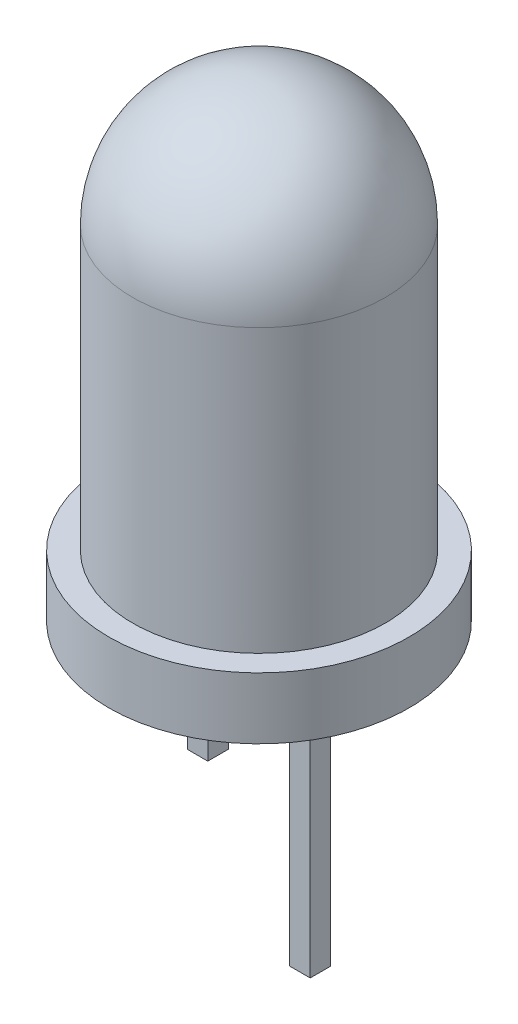
ISO-10303-21;
HEADER;
FILE_DESCRIPTION(('STEP AP214'),'2;1');
FILE_NAME('part.step','',(''),(''),'','','');
FILE_SCHEMA(('AUTOMOTIVE_DESIGN { 1 0 10303 214 1 1 1 1 }'));
ENDSEC;
DATA;
#1=APPLICATION_CONTEXT('core data for automotive mechanical design processes');
#2=APPLICATION_PROTOCOL_DEFINITION('international standard','automotive_design',2000,#1);
#3=PRODUCT_CONTEXT('',#1,'mechanical');
#4=PRODUCT('Part','Part','',(#3));
#5=PRODUCT_RELATED_PRODUCT_CATEGORY('part','',(#4));
#6=PRODUCT_DEFINITION_FORMATION('','',#4);
#7=PRODUCT_DEFINITION_CONTEXT('part definition',#1,'design');
#8=PRODUCT_DEFINITION('design','',#6,#7);
#9=PRODUCT_DEFINITION_SHAPE('','',#8);
#10=(LENGTH_UNIT() NAMED_UNIT(*) SI_UNIT(.MILLI.,.METRE.));
#11=(NAMED_UNIT(*) PLANE_ANGLE_UNIT() SI_UNIT($,.RADIAN.));
#12=(NAMED_UNIT(*) SI_UNIT($,.STERADIAN.) SOLID_ANGLE_UNIT());
#13=UNCERTAINTY_MEASURE_WITH_UNIT(LENGTH_MEASURE(1.E-05),#10,'distance_accuracy_value','');
#14=(GEOMETRIC_REPRESENTATION_CONTEXT(3) GLOBAL_UNCERTAINTY_ASSIGNED_CONTEXT((#13)) GLOBAL_UNIT_ASSIGNED_CONTEXT((#10,
#11,#12)) REPRESENTATION_CONTEXT('',''));
#15=CARTESIAN_POINT('',(0.,0.,0.));
#16=DIRECTION('',(0.,0.,1.));
#17=DIRECTION('',(1.,0.,0.));
#18=AXIS2_PLACEMENT_3D('',#15,#16,#17);
#19=CARTESIAN_POINT('',(-0.00715449381111586,-11.2789100086179,0.));
#20=DIRECTION('',(0.,-1.,0.));
#21=DIRECTION('',(0.,0.,-1.));
#22=AXIS2_PLACEMENT_3D('',#19,#20,#21);
#23=PLANE('',#22);
#24=DIRECTION('',(0.,0.,-1.));
#25=VECTOR('',#24,1.);
#26=CARTESIAN_POINT('',(-3.05515449381112,-11.2789100086179,0.));
#27=LINE('',#26,#25);
#28=CARTESIAN_POINT('',(-3.05515449381112,-11.2789100086179,0.762));
#29=VERTEX_POINT('',#28);
#30=CARTESIAN_POINT('',(-3.05515449381112,-11.2789100086179,-0.762));
#31=VERTEX_POINT('',#30);
#32=EDGE_CURVE('E110',#29,#31,#27,.T.);
#33=ORIENTED_EDGE('',*,*,#32,.T.);
#34=DIRECTION('',(1.,0.,0.));
#35=VECTOR('',#34,1.);
#36=CARTESIAN_POINT('',(-0.00715449381111575,-11.2789100086179,-0.761999999999999));
#37=LINE('',#36,#35);
#38=CARTESIAN_POINT('',(-4.57915449381112,-11.2789100086179,-0.762));
#39=VERTEX_POINT('',#38);
#40=EDGE_CURVE('E124',#39,#31,#37,.T.);
#41=ORIENTED_EDGE('',*,*,#40,.F.);
#42=DIRECTION('',(0.,0.,-1.));
#43=VECTOR('',#42,1.);
#44=CARTESIAN_POINT('',(-4.57915449381112,-11.2789100086179,0.));
#45=LINE('',#44,#43);
#46=CARTESIAN_POINT('',(-4.57915449381112,-11.2789100086179,0.762));
#47=VERTEX_POINT('',#46);
#48=EDGE_CURVE('E137',#47,#39,#45,.T.);
#49=ORIENTED_EDGE('',*,*,#48,.F.);
#50=DIRECTION('',(1.,0.,0.));
#51=VECTOR('',#50,1.);
#52=CARTESIAN_POINT('',(-0.00715449381111597,-11.2789100086179,0.762000000000001));
#53=LINE('',#52,#51);
#54=EDGE_CURVE('E135',#47,#29,#53,.T.);
#55=ORIENTED_EDGE('',*,*,#54,.T.);
#56=EDGE_LOOP('',(#33,#41,#49,#55));
#57=FACE_BOUND('',#56,.T.);
#58=DIRECTION('',(0.,0.,-1.));
#59=VECTOR('',#58,1.);
#60=CARTESIAN_POINT('',(4.56484550618888,-11.2789100086179,0.));
#61=LINE('',#60,#59);
#62=CARTESIAN_POINT('',(4.56484550618888,-11.2789100086179,0.762000000000001));
#63=VERTEX_POINT('',#62);
#64=CARTESIAN_POINT('',(4.56484550618888,-11.2789100086179,-0.761999999999998));
#65=VERTEX_POINT('',#64);
#66=EDGE_CURVE('E115',#63,#65,#61,.T.);
#67=ORIENTED_EDGE('',*,*,#66,.T.);
#68=DIRECTION('',(1.,0.,0.));
#69=VECTOR('',#68,1.);
#70=CARTESIAN_POINT('',(-0.00715449381111564,-11.2789100086179,-0.762));
#71=LINE('',#70,#69);
#72=CARTESIAN_POINT('',(3.04084550618888,-11.2789100086179,-0.761999999999999));
#73=VERTEX_POINT('',#72);
#74=EDGE_CURVE('E147',#73,#65,#71,.T.);
#75=ORIENTED_EDGE('',*,*,#74,.F.);
#76=DIRECTION('',(0.,0.,-1.));
#77=VECTOR('',#76,1.);
#78=CARTESIAN_POINT('',(3.04084550618888,-11.2789100086179,0.));
#79=LINE('',#78,#77);
#80=CARTESIAN_POINT('',(3.04084550618888,-11.2789100086179,0.762000000000001));
#81=VERTEX_POINT('',#80);
#82=EDGE_CURVE('E160',#81,#73,#79,.T.);
#83=ORIENTED_EDGE('',*,*,#82,.F.);
#84=DIRECTION('',(1.,0.,0.));
#85=VECTOR('',#84,1.);
#86=CARTESIAN_POINT('',(-0.00715449381111602,-11.2789100086179,0.762));
#87=LINE('',#86,#85);
#88=EDGE_CURVE('E157',#81,#63,#87,.T.);
#89=ORIENTED_EDGE('',*,*,#88,.T.);
#90=EDGE_LOOP('',(#67,#75,#83,#89));
#91=FACE_BOUND('',#90,.T.);
#92=CARTESIAN_POINT('',(-0.00715449381111586,-11.2789100086179,0.));
#93=DIRECTION('',(0.,-1.,0.));
#94=DIRECTION('',(0.,0.,-1.));
#95=AXIS2_PLACEMENT_3D('',#92,#93,#94);
#96=CIRCLE('',#95,11.176);
#97=CARTESIAN_POINT('',(-0.00715449381111586,-11.2789100086179,-11.176));
#98=VERTEX_POINT('',#97);
#99=EDGE_CURVE('E11',#98,#98,#96,.T.);
#100=ORIENTED_EDGE('',*,*,#99,.T.);
#101=EDGE_LOOP('',(#100));
#102=FACE_BOUND('',#101,.T.);
#103=ADVANCED_FACE('F37',(#57,#91,#102),#23,.T.);
#104=CARTESIAN_POINT('',(-0.00715449381111586,-11.2789100086179,0.));
#105=DIRECTION('',(0.,-1.,0.));
#106=DIRECTION('',(0.,0.,-1.));
#107=AXIS2_PLACEMENT_3D('',#104,#105,#106);
#108=CYLINDRICAL_SURFACE('',#107,11.176);
#109=CARTESIAN_POINT('',(-0.00715449381111586,-6.70691000861787,0.));
#110=DIRECTION('',(0.,-1.,0.));
#111=DIRECTION('',(0.,0.,-1.));
#112=AXIS2_PLACEMENT_3D('',#109,#110,#111);
#113=CIRCLE('',#112,11.176);
#114=CARTESIAN_POINT('',(-0.00715449381111586,-6.70691000861787,-11.176));
#115=VERTEX_POINT('',#114);
#116=EDGE_CURVE('E44',#115,#115,#113,.T.);
#117=ORIENTED_EDGE('',*,*,#116,.T.);
#118=EDGE_LOOP('',(#117));
#119=FACE_BOUND('',#118,.T.);
#120=ORIENTED_EDGE('',*,*,#99,.F.);
#121=EDGE_LOOP('',(#120));
#122=FACE_BOUND('',#121,.T.);
#123=ADVANCED_FACE('F177',(#119,#122),#108,.T.);
#124=CARTESIAN_POINT('',(11.1688455061889,-6.70691000861787,0.));
#125=DIRECTION('',(0.,1.,0.));
#126=DIRECTION('',(0.,0.,1.));
#127=AXIS2_PLACEMENT_3D('',#124,#125,#126);
#128=PLANE('',#127);
#129=CARTESIAN_POINT('',(-0.00715449381111586,-6.70691000861787,0.));
#130=DIRECTION('',(0.,-1.,0.));
#131=DIRECTION('',(0.,0.,-1.));
#132=AXIS2_PLACEMENT_3D('',#129,#130,#131);
#133=CIRCLE('',#132,9.398);
#134=CARTESIAN_POINT('',(-0.00715449381111586,-6.70691000861787,-9.398));
#135=VERTEX_POINT('',#134);
#136=EDGE_CURVE('E172',#135,#135,#133,.T.);
#137=ORIENTED_EDGE('',*,*,#136,.T.);
#138=EDGE_LOOP('',(#137));
#139=FACE_BOUND('',#138,.T.);
#140=ORIENTED_EDGE('',*,*,#116,.F.);
#141=EDGE_LOOP('',(#140));
#142=FACE_BOUND('',#141,.T.);
#143=ADVANCED_FACE('F180',(#139,#142),#128,.T.);
#144=CARTESIAN_POINT('',(-0.00715449381111586,-11.2789100086179,0.));
#145=DIRECTION('',(0.,-1.,0.));
#146=DIRECTION('',(0.,0.,-1.));
#147=AXIS2_PLACEMENT_3D('',#144,#145,#146);
#148=CYLINDRICAL_SURFACE('',#147,9.398);
#149=CARTESIAN_POINT('',(-0.00715449381111586,14.2734899913821,0.));
#150=DIRECTION('',(0.,-1.,0.));
#151=DIRECTION('',(0.,0.,-1.));
#152=AXIS2_PLACEMENT_3D('',#149,#150,#151);
#153=CIRCLE('',#152,9.398);
#154=CARTESIAN_POINT('',(-0.00715449381111586,14.2734899913821,-9.398));
#155=VERTEX_POINT('',#154);
#156=EDGE_CURVE('E169',#155,#155,#153,.T.);
#157=ORIENTED_EDGE('',*,*,#156,.T.);
#158=EDGE_LOOP('',(#157));
#159=FACE_BOUND('',#158,.T.);
#160=ORIENTED_EDGE('',*,*,#136,.F.);
#161=EDGE_LOOP('',(#160));
#162=FACE_BOUND('',#161,.T.);
#163=ADVANCED_FACE('F182',(#159,#162),#148,.T.);
#164=CARTESIAN_POINT('',(-0.00715449381111586,14.2734899913821,0.));
#165=DIRECTION('',(0.,-1.,0.));
#166=DIRECTION('',(1.,0.,0.));
#167=AXIS2_PLACEMENT_3D('',#164,#165,#166);
#168=SPHERICAL_SURFACE('',#167,9.398);
#169=ORIENTED_EDGE('',*,*,#156,.F.);
#170=EDGE_LOOP('',(#169));
#171=FACE_BOUND('',#170,.T.);
#172=ADVANCED_FACE('F189',(#171),#168,.T.);
#173=CARTESIAN_POINT('',(4.56484550618888,-31.5989100086179,0.));
#174=DIRECTION('',(1.,0.,0.));
#175=DIRECTION('',(0.,0.,-1.));
#176=AXIS2_PLACEMENT_3D('',#173,#174,#175);
#177=PLANE('',#176);
#178=ORIENTED_EDGE('',*,*,#66,.F.);
#179=DIRECTION('',(0.,1.,0.));
#180=VECTOR('',#179,1.);
#181=CARTESIAN_POINT('',(4.56484550618888,-31.5989100086179,0.762000000000001));
#182=LINE('',#181,#180);
#183=CARTESIAN_POINT('',(4.56484550618888,-31.5989100086179,0.762000000000001));
#184=VERTEX_POINT('',#183);
#185=EDGE_CURVE('E167',#184,#63,#182,.T.);
#186=ORIENTED_EDGE('',*,*,#185,.F.);
#187=DIRECTION('',(0.,0.,-1.));
#188=VECTOR('',#187,1.);
#189=CARTESIAN_POINT('',(4.56484550618888,-31.5989100086179,0.));
#190=LINE('',#189,#188);
#191=CARTESIAN_POINT('',(4.56484550618888,-31.5989100086179,-0.761999999999998));
#192=VERTEX_POINT('',#191);
#193=EDGE_CURVE('E143',#184,#192,#190,.T.);
#194=ORIENTED_EDGE('',*,*,#193,.T.);
#195=DIRECTION('',(0.,1.,0.));
#196=VECTOR('',#195,1.);
#197=CARTESIAN_POINT('',(4.56484550618888,-31.5989100086179,-0.761999999999998));
#198=LINE('',#197,#196);
#199=EDGE_CURVE('E154',#192,#65,#198,.T.);
#200=ORIENTED_EDGE('',*,*,#199,.T.);
#201=EDGE_LOOP('',(#178,#186,#194,#200));
#202=FACE_BOUND('',#201,.T.);
#203=ADVANCED_FACE('F205',(#202),#177,.T.);
#204=CARTESIAN_POINT('',(-0.00715449381111602,-31.5989100086179,0.762));
#205=DIRECTION('',(0.,0.,1.));
#206=DIRECTION('',(1.,0.,0.));
#207=AXIS2_PLACEMENT_3D('',#204,#205,#206);
#208=PLANE('',#207);
#209=ORIENTED_EDGE('',*,*,#88,.F.);
#210=DIRECTION('',(0.,1.,0.));
#211=VECTOR('',#210,1.);
#212=CARTESIAN_POINT('',(3.04084550618888,-31.5989100086179,0.762000000000001));
#213=LINE('',#212,#211);
#214=CARTESIAN_POINT('',(3.04084550618888,-31.5989100086179,0.762000000000001));
#215=VERTEX_POINT('',#214);
#216=EDGE_CURVE('E165',#215,#81,#213,.T.);
#217=ORIENTED_EDGE('',*,*,#216,.F.);
#218=DIRECTION('',(1.,0.,0.));
#219=VECTOR('',#218,1.);
#220=CARTESIAN_POINT('',(-0.00715449381111602,-31.5989100086179,0.762));
#221=LINE('',#220,#219);
#222=EDGE_CURVE('E146',#215,#184,#221,.T.);
#223=ORIENTED_EDGE('',*,*,#222,.T.);
#224=ORIENTED_EDGE('',*,*,#185,.T.);
#225=EDGE_LOOP('',(#209,#217,#223,#224));
#226=FACE_BOUND('',#225,.T.);
#227=ADVANCED_FACE('F219',(#226),#208,.T.);
#228=CARTESIAN_POINT('',(3.04084550618888,-31.5989100086179,0.));
#229=DIRECTION('',(1.,0.,0.));
#230=DIRECTION('',(0.,0.,-1.));
#231=AXIS2_PLACEMENT_3D('',#228,#229,#230);
#232=PLANE('',#231);
#233=ORIENTED_EDGE('',*,*,#82,.T.);
#234=DIRECTION('',(0.,1.,0.));
#235=VECTOR('',#234,1.);
#236=CARTESIAN_POINT('',(3.04084550618888,-31.5989100086179,-0.761999999999999));
#237=LINE('',#236,#235);
#238=CARTESIAN_POINT('',(3.04084550618888,-31.5989100086179,-0.761999999999999));
#239=VERTEX_POINT('',#238);
#240=EDGE_CURVE('E59',#239,#73,#237,.T.);
#241=ORIENTED_EDGE('',*,*,#240,.F.);
#242=DIRECTION('',(0.,0.,-1.));
#243=VECTOR('',#242,1.);
#244=CARTESIAN_POINT('',(3.04084550618888,-31.5989100086179,0.));
#245=LINE('',#244,#243);
#246=EDGE_CURVE('E150',#215,#239,#245,.T.);
#247=ORIENTED_EDGE('',*,*,#246,.F.);
#248=ORIENTED_EDGE('',*,*,#216,.T.);
#249=EDGE_LOOP('',(#233,#241,#247,#248));
#250=FACE_BOUND('',#249,.T.);
#251=ADVANCED_FACE('F211',(#250),#232,.F.);
#252=CARTESIAN_POINT('',(-0.00715449381111564,-31.5989100086179,-0.762));
#253=DIRECTION('',(0.,0.,1.));
#254=DIRECTION('',(1.,0.,0.));
#255=AXIS2_PLACEMENT_3D('',#252,#253,#254);
#256=PLANE('',#255);
#257=ORIENTED_EDGE('',*,*,#74,.T.);
#258=ORIENTED_EDGE('',*,*,#199,.F.);
#259=DIRECTION('',(1.,0.,0.));
#260=VECTOR('',#259,1.);
#261=CARTESIAN_POINT('',(-0.00715449381111564,-31.5989100086179,-0.762));
#262=LINE('',#261,#260);
#263=EDGE_CURVE('E152',#239,#192,#262,.T.);
#264=ORIENTED_EDGE('',*,*,#263,.F.);
#265=ORIENTED_EDGE('',*,*,#240,.T.);
#266=EDGE_LOOP('',(#257,#258,#264,#265));
#267=FACE_BOUND('',#266,.T.);
#268=ADVANCED_FACE('F208',(#267),#256,.F.);
#269=CARTESIAN_POINT('',(-0.00715449381111586,-31.5989100086179,0.));
#270=DIRECTION('',(0.,-1.,0.));
#271=DIRECTION('',(0.,0.,-1.));
#272=AXIS2_PLACEMENT_3D('',#269,#270,#271);
#273=PLANE('',#272);
#274=ORIENTED_EDGE('',*,*,#193,.F.);
#275=ORIENTED_EDGE('',*,*,#222,.F.);
#276=ORIENTED_EDGE('',*,*,#246,.T.);
#277=ORIENTED_EDGE('',*,*,#263,.T.);
#278=EDGE_LOOP('',(#274,#275,#276,#277));
#279=FACE_BOUND('',#278,.T.);
#280=ADVANCED_FACE('F210',(#279),#273,.T.);
#281=CARTESIAN_POINT('',(-3.05515449381112,-21.4389100086179,0.));
#282=DIRECTION('',(1.,0.,0.));
#283=DIRECTION('',(0.,0.,-1.));
#284=AXIS2_PLACEMENT_3D('',#281,#282,#283);
#285=PLANE('',#284);
#286=ORIENTED_EDGE('',*,*,#32,.F.);
#287=DIRECTION('',(0.,1.,0.));
#288=VECTOR('',#287,1.);
#289=CARTESIAN_POINT('',(-3.05515449381112,-21.4389100086179,0.762));
#290=LINE('',#289,#288);
#291=CARTESIAN_POINT('',(-3.05515449381112,-21.4389100086179,0.762));
#292=VERTEX_POINT('',#291);
#293=EDGE_CURVE('E105',#292,#29,#290,.T.);
#294=ORIENTED_EDGE('',*,*,#293,.F.);
#295=DIRECTION('',(0.,0.,-1.));
#296=VECTOR('',#295,1.);
#297=CARTESIAN_POINT('',(-3.05515449381112,-21.4389100086179,0.));
#298=LINE('',#297,#296);
#299=CARTESIAN_POINT('',(-3.05515449381112,-21.4389100086179,-0.762));
#300=VERTEX_POINT('',#299);
#301=EDGE_CURVE('E108',#292,#300,#298,.T.);
#302=ORIENTED_EDGE('',*,*,#301,.T.);
#303=DIRECTION('',(0.,1.,0.));
#304=VECTOR('',#303,1.);
#305=CARTESIAN_POINT('',(-3.05515449381112,-21.4389100086179,-0.762));
#306=LINE('',#305,#304);
#307=EDGE_CURVE('E133',#300,#31,#306,.T.);
#308=ORIENTED_EDGE('',*,*,#307,.T.);
#309=EDGE_LOOP('',(#286,#294,#302,#308));
#310=FACE_BOUND('',#309,.T.);
#311=ADVANCED_FACE('F107',(#310),#285,.T.);
#312=CARTESIAN_POINT('',(-0.00715449381111597,-21.4389100086179,0.762000000000001));
#313=DIRECTION('',(0.,0.,1.));
#314=DIRECTION('',(1.,0.,0.));
#315=AXIS2_PLACEMENT_3D('',#312,#313,#314);
#316=PLANE('',#315);
#317=ORIENTED_EDGE('',*,*,#54,.F.);
#318=DIRECTION('',(0.,1.,0.));
#319=VECTOR('',#318,1.);
#320=CARTESIAN_POINT('',(-4.57915449381112,-21.4389100086179,0.762));
#321=LINE('',#320,#319);
#322=CARTESIAN_POINT('',(-4.57915449381112,-21.4389100086179,0.762));
#323=VERTEX_POINT('',#322);
#324=EDGE_CURVE('E116',#323,#47,#321,.T.);
#325=ORIENTED_EDGE('',*,*,#324,.F.);
#326=DIRECTION('',(1.,0.,0.));
#327=VECTOR('',#326,1.);
#328=CARTESIAN_POINT('',(-0.00715449381111597,-21.4389100086179,0.762000000000001));
#329=LINE('',#328,#327);
#330=EDGE_CURVE('E121',#323,#292,#329,.T.);
#331=ORIENTED_EDGE('',*,*,#330,.T.);
#332=ORIENTED_EDGE('',*,*,#293,.T.);
#333=EDGE_LOOP('',(#317,#325,#331,#332));
#334=FACE_BOUND('',#333,.T.);
#335=ADVANCED_FACE('F126',(#334),#316,.T.);
#336=CARTESIAN_POINT('',(-4.57915449381112,-21.4389100086179,0.));
#337=DIRECTION('',(1.,0.,0.));
#338=DIRECTION('',(0.,0.,-1.));
#339=AXIS2_PLACEMENT_3D('',#336,#337,#338);
#340=PLANE('',#339);
#341=ORIENTED_EDGE('',*,*,#48,.T.);
#342=DIRECTION('',(0.,1.,0.));
#343=VECTOR('',#342,1.);
#344=CARTESIAN_POINT('',(-4.57915449381112,-21.4389100086179,-0.762));
#345=LINE('',#344,#343);
#346=CARTESIAN_POINT('',(-4.57915449381112,-21.4389100086179,-0.762));
#347=VERTEX_POINT('',#346);
#348=EDGE_CURVE('E51',#347,#39,#345,.T.);
#349=ORIENTED_EDGE('',*,*,#348,.F.);
#350=DIRECTION('',(0.,0.,-1.));
#351=VECTOR('',#350,1.);
#352=CARTESIAN_POINT('',(-4.57915449381112,-21.4389100086179,0.));
#353=LINE('',#352,#351);
#354=EDGE_CURVE('E128',#323,#347,#353,.T.);
#355=ORIENTED_EDGE('',*,*,#354,.F.);
#356=ORIENTED_EDGE('',*,*,#324,.T.);
#357=EDGE_LOOP('',(#341,#349,#355,#356));
#358=FACE_BOUND('',#357,.T.);
#359=ADVANCED_FACE('F281',(#358),#340,.F.);
#360=CARTESIAN_POINT('',(-0.00715449381111575,-21.4389100086179,-0.761999999999999));
#361=DIRECTION('',(0.,0.,1.));
#362=DIRECTION('',(1.,0.,0.));
#363=AXIS2_PLACEMENT_3D('',#360,#361,#362);
#364=PLANE('',#363);
#365=ORIENTED_EDGE('',*,*,#40,.T.);
#366=ORIENTED_EDGE('',*,*,#307,.F.);
#367=DIRECTION('',(1.,0.,0.));
#368=VECTOR('',#367,1.);
#369=CARTESIAN_POINT('',(-0.00715449381111575,-21.4389100086179,-0.761999999999999));
#370=LINE('',#369,#368);
#371=EDGE_CURVE('E122',#347,#300,#370,.T.);
#372=ORIENTED_EDGE('',*,*,#371,.F.);
#373=ORIENTED_EDGE('',*,*,#348,.T.);
#374=EDGE_LOOP('',(#365,#366,#372,#373));
#375=FACE_BOUND('',#374,.T.);
#376=ADVANCED_FACE('F290',(#375),#364,.F.);
#377=CARTESIAN_POINT('',(-0.00715449381111586,-21.4389100086179,0.));
#378=DIRECTION('',(0.,-1.,0.));
#379=DIRECTION('',(0.,0.,-1.));
#380=AXIS2_PLACEMENT_3D('',#377,#378,#379);
#381=PLANE('',#380);
#382=ORIENTED_EDGE('',*,*,#301,.F.);
#383=ORIENTED_EDGE('',*,*,#330,.F.);
#384=ORIENTED_EDGE('',*,*,#354,.T.);
#385=ORIENTED_EDGE('',*,*,#371,.T.);
#386=EDGE_LOOP('',(#382,#383,#384,#385));
#387=FACE_BOUND('',#386,.T.);
#388=ADVANCED_FACE('F120',(#387),#381,.T.);
#389=CLOSED_SHELL('',(#103,#123,#143,#163,#172,#203,#227,#251,#268,#280,#311,#335,#359,#376,#388));
#390=MANIFOLD_SOLID_BREP('B2',#389);
#391=ADVANCED_BREP_SHAPE_REPRESENTATION('',(#18,#390),#14);
#392=SHAPE_DEFINITION_REPRESENTATION(#9,#391);
ENDSEC;
END-ISO-10303-21;
